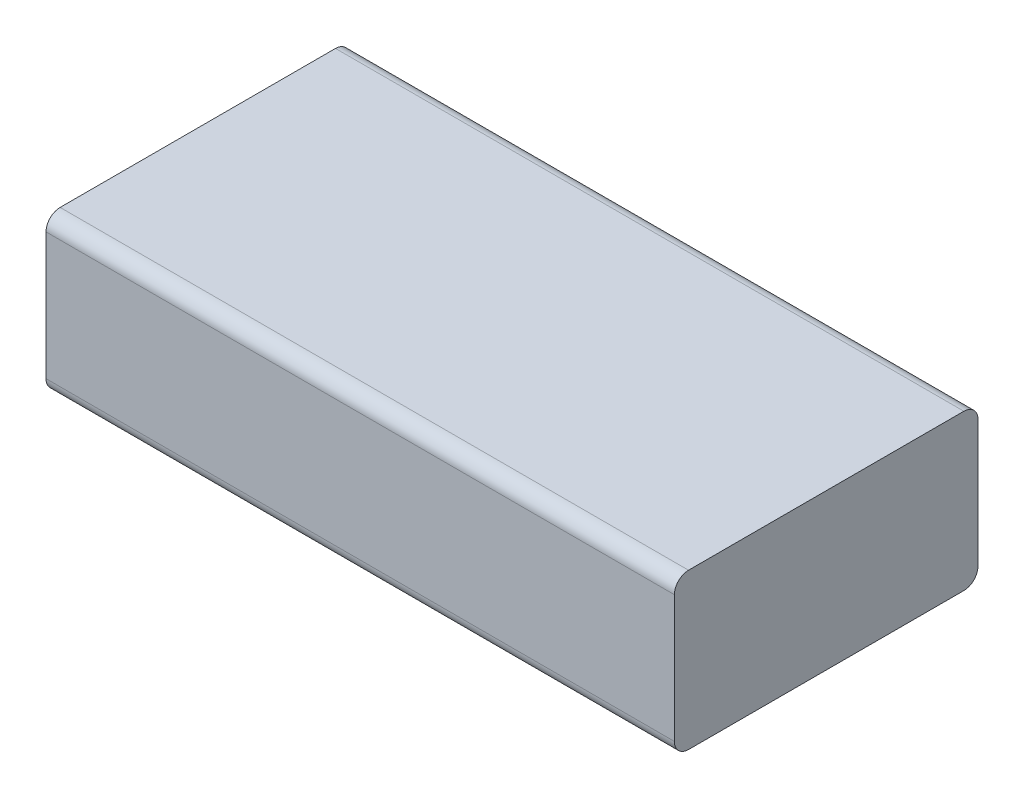
ISO-10303-21;
HEADER;
FILE_DESCRIPTION(('STEP AP214'),'2;1');
FILE_NAME('part.step','',(''),(''),'','','');
FILE_SCHEMA(('AUTOMOTIVE_DESIGN { 1 0 10303 214 1 1 1 1 }'));
ENDSEC;
DATA;
#1=APPLICATION_CONTEXT('core data for automotive mechanical design processes');
#2=APPLICATION_PROTOCOL_DEFINITION('international standard','automotive_design',2000,#1);
#3=PRODUCT_CONTEXT('',#1,'mechanical');
#4=PRODUCT('Part','Part','',(#3));
#5=PRODUCT_RELATED_PRODUCT_CATEGORY('part','',(#4));
#6=PRODUCT_DEFINITION_FORMATION('','',#4);
#7=PRODUCT_DEFINITION_CONTEXT('part definition',#1,'design');
#8=PRODUCT_DEFINITION('design','',#6,#7);
#9=PRODUCT_DEFINITION_SHAPE('','',#8);
#10=(LENGTH_UNIT() NAMED_UNIT(*) SI_UNIT(.MILLI.,.METRE.));
#11=(NAMED_UNIT(*) PLANE_ANGLE_UNIT() SI_UNIT($,.RADIAN.));
#12=(NAMED_UNIT(*) SI_UNIT($,.STERADIAN.) SOLID_ANGLE_UNIT());
#13=UNCERTAINTY_MEASURE_WITH_UNIT(LENGTH_MEASURE(1.E-05),#10,'distance_accuracy_value','');
#14=(GEOMETRIC_REPRESENTATION_CONTEXT(3) GLOBAL_UNCERTAINTY_ASSIGNED_CONTEXT((#13)) GLOBAL_UNIT_ASSIGNED_CONTEXT((#10,
#11,#12)) REPRESENTATION_CONTEXT('',''));
#15=CARTESIAN_POINT('',(0.,0.,0.));
#16=DIRECTION('',(0.,0.,1.));
#17=DIRECTION('',(1.,0.,0.));
#18=AXIS2_PLACEMENT_3D('',#15,#16,#17);
#19=CARTESIAN_POINT('',(-44.5,22.,-21.5));
#20=DIRECTION('',(1.,0.,0.));
#21=DIRECTION('',(0.,0.,-1.));
#22=AXIS2_PLACEMENT_3D('',#19,#20,#21);
#23=PLANE('',#22);
#24=DIRECTION('',(0.,-1.,0.));
#25=VECTOR('',#24,1.);
#26=CARTESIAN_POINT('',(-44.5,22.,-21.5));
#27=LINE('',#26,#25);
#28=CARTESIAN_POINT('',(-44.5,20.,-21.5));
#29=VERTEX_POINT('',#28);
#30=CARTESIAN_POINT('',(-44.5,2.,-21.5));
#31=VERTEX_POINT('',#30);
#32=EDGE_CURVE('E101',#29,#31,#27,.T.);
#33=ORIENTED_EDGE('',*,*,#32,.T.);
#34=CARTESIAN_POINT('',(-44.5,2.,-19.5));
#35=DIRECTION('',(1.,0.,0.));
#36=DIRECTION('',(0.,0.,-1.));
#37=AXIS2_PLACEMENT_3D('',#34,#35,#36);
#38=CIRCLE('',#37,2.);
#39=CARTESIAN_POINT('',(-44.5,0.,-19.5));
#40=VERTEX_POINT('',#39);
#41=EDGE_CURVE('E108',#31,#40,#38,.F.);
#42=ORIENTED_EDGE('',*,*,#41,.T.);
#43=DIRECTION('',(0.,0.,1.));
#44=VECTOR('',#43,1.);
#45=CARTESIAN_POINT('',(-44.5,0.,-21.5));
#46=LINE('',#45,#44);
#47=CARTESIAN_POINT('',(-44.5,0.,19.5));
#48=VERTEX_POINT('',#47);
#49=EDGE_CURVE('E168',#40,#48,#46,.T.);
#50=ORIENTED_EDGE('',*,*,#49,.T.);
#51=CARTESIAN_POINT('',(-44.5,2.,19.5));
#52=DIRECTION('',(1.,0.,0.));
#53=DIRECTION('',(0.,0.,-1.));
#54=AXIS2_PLACEMENT_3D('',#51,#52,#53);
#55=CIRCLE('',#54,2.);
#56=CARTESIAN_POINT('',(-44.5,2.,21.5));
#57=VERTEX_POINT('',#56);
#58=EDGE_CURVE('E109',#48,#57,#55,.F.);
#59=ORIENTED_EDGE('',*,*,#58,.T.);
#60=DIRECTION('',(0.,-1.,0.));
#61=VECTOR('',#60,1.);
#62=CARTESIAN_POINT('',(-44.5,22.,21.5));
#63=LINE('',#62,#61);
#64=CARTESIAN_POINT('',(-44.5,20.,21.5));
#65=VERTEX_POINT('',#64);
#66=EDGE_CURVE('E125',#65,#57,#63,.T.);
#67=ORIENTED_EDGE('',*,*,#66,.F.);
#68=CARTESIAN_POINT('',(-44.5,20.,19.5));
#69=DIRECTION('',(1.,0.,0.));
#70=DIRECTION('',(0.,0.,-1.));
#71=AXIS2_PLACEMENT_3D('',#68,#69,#70);
#72=CIRCLE('',#71,2.);
#73=CARTESIAN_POINT('',(-44.5,22.,19.5));
#74=VERTEX_POINT('',#73);
#75=EDGE_CURVE('E127',#65,#74,#72,.F.);
#76=ORIENTED_EDGE('',*,*,#75,.T.);
#77=DIRECTION('',(0.,0.,1.));
#78=VECTOR('',#77,1.);
#79=CARTESIAN_POINT('',(-44.5,22.,-21.5));
#80=LINE('',#79,#78);
#81=CARTESIAN_POINT('',(-44.5,22.,-19.5));
#82=VERTEX_POINT('',#81);
#83=EDGE_CURVE('E103',#82,#74,#80,.T.);
#84=ORIENTED_EDGE('',*,*,#83,.F.);
#85=CARTESIAN_POINT('',(-44.5,20.,-19.5));
#86=DIRECTION('',(1.,0.,0.));
#87=DIRECTION('',(0.,0.,-1.));
#88=AXIS2_PLACEMENT_3D('',#85,#86,#87);
#89=CIRCLE('',#88,2.);
#90=EDGE_CURVE('E99',#82,#29,#89,.F.);
#91=ORIENTED_EDGE('',*,*,#90,.T.);
#92=EDGE_LOOP('',(#33,#42,#50,#59,#67,#76,#84,#91));
#93=FACE_BOUND('',#92,.T.);
#94=ADVANCED_FACE('F33',(#93),#23,.F.);
#95=CARTESIAN_POINT('',(-44.5,22.,21.5));
#96=DIRECTION('',(0.,0.,-1.));
#97=DIRECTION('',(-1.,0.,0.));
#98=AXIS2_PLACEMENT_3D('',#95,#96,#97);
#99=PLANE('',#98);
#100=ORIENTED_EDGE('',*,*,#66,.T.);
#101=DIRECTION('',(1.,0.,0.));
#102=VECTOR('',#101,1.);
#103=CARTESIAN_POINT('',(-44.5,2.,21.5));
#104=LINE('',#103,#102);
#105=CARTESIAN_POINT('',(44.5,2.,21.5));
#106=VERTEX_POINT('',#105);
#107=EDGE_CURVE('E11',#57,#106,#104,.T.);
#108=ORIENTED_EDGE('',*,*,#107,.T.);
#109=DIRECTION('',(0.,-1.,0.));
#110=VECTOR('',#109,1.);
#111=CARTESIAN_POINT('',(44.5,22.,21.5));
#112=LINE('',#111,#110);
#113=CARTESIAN_POINT('',(44.5,20.,21.5));
#114=VERTEX_POINT('',#113);
#115=EDGE_CURVE('E130',#114,#106,#112,.T.);
#116=ORIENTED_EDGE('',*,*,#115,.F.);
#117=DIRECTION('',(1.,0.,0.));
#118=VECTOR('',#117,1.);
#119=CARTESIAN_POINT('',(-44.5,20.,21.5));
#120=LINE('',#119,#118);
#121=EDGE_CURVE('E41',#114,#65,#120,.F.);
#122=ORIENTED_EDGE('',*,*,#121,.T.);
#123=EDGE_LOOP('',(#100,#108,#116,#122));
#124=FACE_BOUND('',#123,.T.);
#125=ADVANCED_FACE('F153',(#124),#99,.F.);
#126=CARTESIAN_POINT('',(44.5,22.,-21.5));
#127=DIRECTION('',(-1.,0.,0.));
#128=DIRECTION('',(0.,0.,1.));
#129=AXIS2_PLACEMENT_3D('',#126,#127,#128);
#130=PLANE('',#129);
#131=DIRECTION('',(0.,0.,-1.));
#132=VECTOR('',#131,1.);
#133=CARTESIAN_POINT('',(44.5,0.,-21.5));
#134=LINE('',#133,#132);
#135=CARTESIAN_POINT('',(44.5,0.,19.5));
#136=VERTEX_POINT('',#135);
#137=CARTESIAN_POINT('',(44.5,0.,-19.5));
#138=VERTEX_POINT('',#137);
#139=EDGE_CURVE('E165',#136,#138,#134,.T.);
#140=ORIENTED_EDGE('',*,*,#139,.T.);
#141=CARTESIAN_POINT('',(44.5,2.,-19.5));
#142=DIRECTION('',(-1.,0.,0.));
#143=DIRECTION('',(0.,0.,1.));
#144=AXIS2_PLACEMENT_3D('',#141,#142,#143);
#145=CIRCLE('',#144,2.);
#146=CARTESIAN_POINT('',(44.5,2.,-21.5));
#147=VERTEX_POINT('',#146);
#148=EDGE_CURVE('E144',#138,#147,#145,.F.);
#149=ORIENTED_EDGE('',*,*,#148,.T.);
#150=DIRECTION('',(0.,-1.,0.));
#151=VECTOR('',#150,1.);
#152=CARTESIAN_POINT('',(44.5,22.,-21.5));
#153=LINE('',#152,#151);
#154=CARTESIAN_POINT('',(44.5,20.,-21.5));
#155=VERTEX_POINT('',#154);
#156=EDGE_CURVE('E119',#155,#147,#153,.T.);
#157=ORIENTED_EDGE('',*,*,#156,.F.);
#158=CARTESIAN_POINT('',(44.5,20.,-19.5));
#159=DIRECTION('',(-1.,0.,0.));
#160=DIRECTION('',(0.,0.,1.));
#161=AXIS2_PLACEMENT_3D('',#158,#159,#160);
#162=CIRCLE('',#161,2.);
#163=CARTESIAN_POINT('',(44.5,22.,-19.5));
#164=VERTEX_POINT('',#163);
#165=EDGE_CURVE('E124',#155,#164,#162,.F.);
#166=ORIENTED_EDGE('',*,*,#165,.T.);
#167=DIRECTION('',(0.,0.,-1.));
#168=VECTOR('',#167,1.);
#169=CARTESIAN_POINT('',(44.5,22.,-21.5));
#170=LINE('',#169,#168);
#171=CARTESIAN_POINT('',(44.5,22.,19.5));
#172=VERTEX_POINT('',#171);
#173=EDGE_CURVE('E120',#172,#164,#170,.T.);
#174=ORIENTED_EDGE('',*,*,#173,.F.);
#175=CARTESIAN_POINT('',(44.5,20.,19.5));
#176=DIRECTION('',(-1.,0.,0.));
#177=DIRECTION('',(0.,0.,1.));
#178=AXIS2_PLACEMENT_3D('',#175,#176,#177);
#179=CIRCLE('',#178,2.);
#180=EDGE_CURVE('E55',#172,#114,#179,.F.);
#181=ORIENTED_EDGE('',*,*,#180,.T.);
#182=ORIENTED_EDGE('',*,*,#115,.T.);
#183=CARTESIAN_POINT('',(44.5,2.,19.5));
#184=DIRECTION('',(-1.,0.,0.));
#185=DIRECTION('',(0.,0.,1.));
#186=AXIS2_PLACEMENT_3D('',#183,#184,#185);
#187=CIRCLE('',#186,2.);
#188=EDGE_CURVE('E48',#106,#136,#187,.F.);
#189=ORIENTED_EDGE('',*,*,#188,.T.);
#190=EDGE_LOOP('',(#140,#149,#157,#166,#174,#181,#182,#189));
#191=FACE_BOUND('',#190,.T.);
#192=ADVANCED_FACE('F163',(#191),#130,.F.);
#193=CARTESIAN_POINT('',(-44.5,22.,-21.5));
#194=DIRECTION('',(0.,0.,1.));
#195=DIRECTION('',(1.,0.,0.));
#196=AXIS2_PLACEMENT_3D('',#193,#194,#195);
#197=PLANE('',#196);
#198=ORIENTED_EDGE('',*,*,#156,.T.);
#199=DIRECTION('',(-1.,0.,0.));
#200=VECTOR('',#199,1.);
#201=CARTESIAN_POINT('',(-44.5,2.,-21.5));
#202=LINE('',#201,#200);
#203=EDGE_CURVE('E118',#147,#31,#202,.T.);
#204=ORIENTED_EDGE('',*,*,#203,.T.);
#205=ORIENTED_EDGE('',*,*,#32,.F.);
#206=DIRECTION('',(-1.,0.,0.));
#207=VECTOR('',#206,1.);
#208=CARTESIAN_POINT('',(44.5,20.,-21.5));
#209=LINE('',#208,#207);
#210=EDGE_CURVE('E115',#29,#155,#209,.F.);
#211=ORIENTED_EDGE('',*,*,#210,.T.);
#212=EDGE_LOOP('',(#198,#204,#205,#211));
#213=FACE_BOUND('',#212,.T.);
#214=ADVANCED_FACE('F114',(#213),#197,.F.);
#215=CARTESIAN_POINT('',(0.,22.,0.));
#216=DIRECTION('',(0.,1.,0.));
#217=DIRECTION('',(0.,0.,1.));
#218=AXIS2_PLACEMENT_3D('',#215,#216,#217);
#219=PLANE('',#218);
#220=ORIENTED_EDGE('',*,*,#173,.T.);
#221=DIRECTION('',(-1.,0.,0.));
#222=VECTOR('',#221,1.);
#223=CARTESIAN_POINT('',(-44.5,22.,-19.5));
#224=LINE('',#223,#222);
#225=EDGE_CURVE('E149',#164,#82,#224,.T.);
#226=ORIENTED_EDGE('',*,*,#225,.T.);
#227=ORIENTED_EDGE('',*,*,#83,.T.);
#228=DIRECTION('',(1.,0.,0.));
#229=VECTOR('',#228,1.);
#230=CARTESIAN_POINT('',(44.5,22.,19.5));
#231=LINE('',#230,#229);
#232=EDGE_CURVE('E146',#74,#172,#231,.T.);
#233=ORIENTED_EDGE('',*,*,#232,.T.);
#234=EDGE_LOOP('',(#220,#226,#227,#233));
#235=FACE_BOUND('',#234,.T.);
#236=ADVANCED_FACE('F161',(#235),#219,.T.);
#237=CARTESIAN_POINT('',(0.,0.,0.));
#238=DIRECTION('',(0.,1.,0.));
#239=DIRECTION('',(0.,0.,1.));
#240=AXIS2_PLACEMENT_3D('',#237,#238,#239);
#241=PLANE('',#240);
#242=ORIENTED_EDGE('',*,*,#49,.F.);
#243=DIRECTION('',(-1.,0.,0.));
#244=VECTOR('',#243,1.);
#245=CARTESIAN_POINT('',(0.,0.,-19.5));
#246=LINE('',#245,#244);
#247=EDGE_CURVE('E139',#40,#138,#246,.F.);
#248=ORIENTED_EDGE('',*,*,#247,.T.);
#249=ORIENTED_EDGE('',*,*,#139,.F.);
#250=DIRECTION('',(1.,0.,0.));
#251=VECTOR('',#250,1.);
#252=CARTESIAN_POINT('',(0.,0.,19.5));
#253=LINE('',#252,#251);
#254=EDGE_CURVE('E137',#136,#48,#253,.F.);
#255=ORIENTED_EDGE('',*,*,#254,.T.);
#256=EDGE_LOOP('',(#242,#248,#249,#255));
#257=FACE_BOUND('',#256,.T.);
#258=ADVANCED_FACE('F175',(#257),#241,.F.);
#259=CARTESIAN_POINT('',(-44.5,2.,-19.5));
#260=DIRECTION('',(-1.,0.,0.));
#261=DIRECTION('',(0.,0.,1.));
#262=AXIS2_PLACEMENT_3D('',#259,#260,#261);
#263=CYLINDRICAL_SURFACE('',#262,2.);
#264=ORIENTED_EDGE('',*,*,#148,.F.);
#265=ORIENTED_EDGE('',*,*,#247,.F.);
#266=ORIENTED_EDGE('',*,*,#41,.F.);
#267=ORIENTED_EDGE('',*,*,#203,.F.);
#268=EDGE_LOOP('',(#264,#265,#266,#267));
#269=FACE_BOUND('',#268,.T.);
#270=ADVANCED_FACE('F183',(#269),#263,.T.);
#271=CARTESIAN_POINT('',(0.,20.,-19.5));
#272=DIRECTION('',(1.,0.,0.));
#273=DIRECTION('',(0.,0.,-1.));
#274=AXIS2_PLACEMENT_3D('',#271,#272,#273);
#275=CYLINDRICAL_SURFACE('',#274,2.);
#276=ORIENTED_EDGE('',*,*,#165,.F.);
#277=ORIENTED_EDGE('',*,*,#210,.F.);
#278=ORIENTED_EDGE('',*,*,#90,.F.);
#279=ORIENTED_EDGE('',*,*,#225,.F.);
#280=EDGE_LOOP('',(#276,#277,#278,#279));
#281=FACE_BOUND('',#280,.T.);
#282=ADVANCED_FACE('F123',(#281),#275,.T.);
#283=CARTESIAN_POINT('',(-44.5,2.,19.5));
#284=DIRECTION('',(1.,0.,0.));
#285=DIRECTION('',(0.,0.,-1.));
#286=AXIS2_PLACEMENT_3D('',#283,#284,#285);
#287=CYLINDRICAL_SURFACE('',#286,2.);
#288=ORIENTED_EDGE('',*,*,#58,.F.);
#289=ORIENTED_EDGE('',*,*,#254,.F.);
#290=ORIENTED_EDGE('',*,*,#188,.F.);
#291=ORIENTED_EDGE('',*,*,#107,.F.);
#292=EDGE_LOOP('',(#288,#289,#290,#291));
#293=FACE_BOUND('',#292,.T.);
#294=ADVANCED_FACE('F177',(#293),#287,.T.);
#295=CARTESIAN_POINT('',(0.,20.,19.5));
#296=DIRECTION('',(-1.,0.,0.));
#297=DIRECTION('',(0.,0.,1.));
#298=AXIS2_PLACEMENT_3D('',#295,#296,#297);
#299=CYLINDRICAL_SURFACE('',#298,2.);
#300=ORIENTED_EDGE('',*,*,#75,.F.);
#301=ORIENTED_EDGE('',*,*,#121,.F.);
#302=ORIENTED_EDGE('',*,*,#180,.F.);
#303=ORIENTED_EDGE('',*,*,#232,.F.);
#304=EDGE_LOOP('',(#300,#301,#302,#303));
#305=FACE_BOUND('',#304,.T.);
#306=ADVANCED_FACE('F35',(#305),#299,.T.);
#307=CLOSED_SHELL('',(#94,#125,#192,#214,#236,#258,#270,#282,#294,#306));
#308=MANIFOLD_SOLID_BREP('B2',#307);
#309=ADVANCED_BREP_SHAPE_REPRESENTATION('',(#18,#308),#14);
#310=SHAPE_DEFINITION_REPRESENTATION(#9,#309);
ENDSEC;
END-ISO-10303-21;
